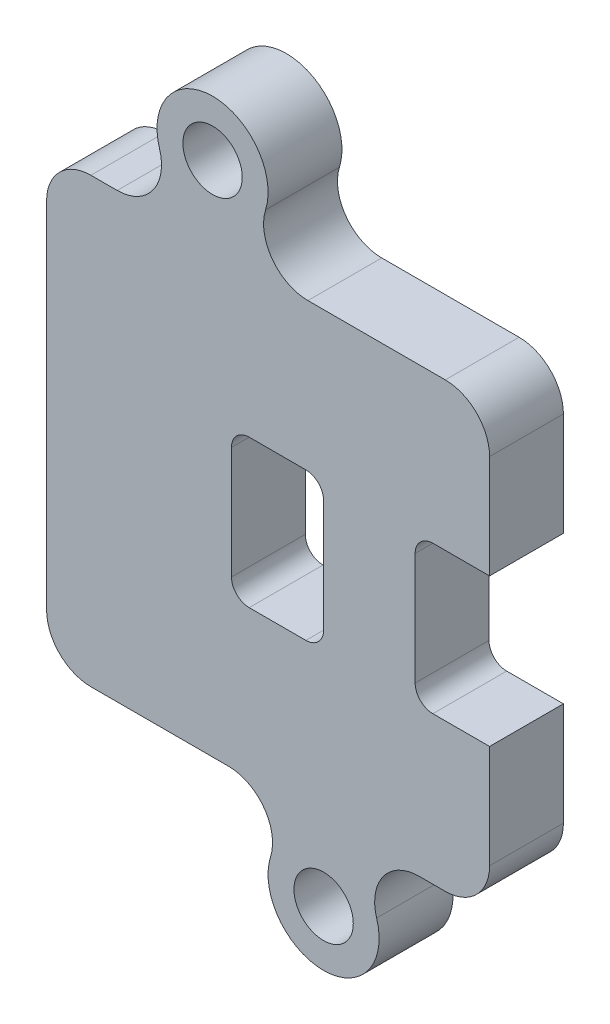
ISO-10303-21;
HEADER;
FILE_DESCRIPTION(('STEP AP214'),'2;1');
FILE_NAME('part.step','',(''),(''),'','','');
FILE_SCHEMA(('AUTOMOTIVE_DESIGN { 1 0 10303 214 1 1 1 1 }'));
ENDSEC;
DATA;
#1=APPLICATION_CONTEXT('core data for automotive mechanical design processes');
#2=APPLICATION_PROTOCOL_DEFINITION('international standard','automotive_design',2000,#1);
#3=PRODUCT_CONTEXT('',#1,'mechanical');
#4=PRODUCT('Part','Part','',(#3));
#5=PRODUCT_RELATED_PRODUCT_CATEGORY('part','',(#4));
#6=PRODUCT_DEFINITION_FORMATION('','',#4);
#7=PRODUCT_DEFINITION_CONTEXT('part definition',#1,'design');
#8=PRODUCT_DEFINITION('design','',#6,#7);
#9=PRODUCT_DEFINITION_SHAPE('','',#8);
#10=(LENGTH_UNIT() NAMED_UNIT(*) SI_UNIT(.MILLI.,.METRE.));
#11=(NAMED_UNIT(*) PLANE_ANGLE_UNIT() SI_UNIT($,.RADIAN.));
#12=(NAMED_UNIT(*) SI_UNIT($,.STERADIAN.) SOLID_ANGLE_UNIT());
#13=UNCERTAINTY_MEASURE_WITH_UNIT(LENGTH_MEASURE(1.E-05),#10,'distance_accuracy_value','');
#14=(GEOMETRIC_REPRESENTATION_CONTEXT(3) GLOBAL_UNCERTAINTY_ASSIGNED_CONTEXT((#13)) GLOBAL_UNIT_ASSIGNED_CONTEXT((#10,
#11,#12)) REPRESENTATION_CONTEXT('',''));
#15=CARTESIAN_POINT('',(0.,0.,0.));
#16=DIRECTION('',(0.,0.,1.));
#17=DIRECTION('',(1.,0.,0.));
#18=AXIS2_PLACEMENT_3D('',#15,#16,#17);
#19=CARTESIAN_POINT('',(-1.524,20.574,6.35));
#20=DIRECTION('',(0.,0.,-1.));
#21=DIRECTION('',(-1.,0.,0.));
#22=AXIS2_PLACEMENT_3D('',#19,#20,#21);
#23=CYLINDRICAL_SURFACE('',#22,1.524);
#24=CARTESIAN_POINT('',(-1.524,20.574,0.));
#25=DIRECTION('',(0.,0.,1.));
#26=DIRECTION('',(1.,0.,0.));
#27=AXIS2_PLACEMENT_3D('',#24,#25,#26);
#28=CIRCLE('',#27,1.524);
#29=CARTESIAN_POINT('',(-1.524,19.05,0.));
#30=VERTEX_POINT('',#29);
#31=CARTESIAN_POINT('',(0.,20.574,0.));
#32=VERTEX_POINT('',#31);
#33=EDGE_CURVE('E357',#30,#32,#28,.T.);
#34=ORIENTED_EDGE('',*,*,#33,.F.);
#35=DIRECTION('',(0.,0.,-1.));
#36=VECTOR('',#35,1.);
#37=CARTESIAN_POINT('',(-1.524,19.05,6.35));
#38=LINE('',#37,#36);
#39=CARTESIAN_POINT('',(-1.524,19.05,6.35));
#40=VERTEX_POINT('',#39);
#41=EDGE_CURVE('E11',#40,#30,#38,.T.);
#42=ORIENTED_EDGE('',*,*,#41,.F.);
#43=CARTESIAN_POINT('',(-1.524,20.574,6.35));
#44=DIRECTION('',(0.,0.,1.));
#45=DIRECTION('',(1.,0.,0.));
#46=AXIS2_PLACEMENT_3D('',#43,#44,#45);
#47=CIRCLE('',#46,1.524);
#48=CARTESIAN_POINT('',(0.,20.574,6.35));
#49=VERTEX_POINT('',#48);
#50=EDGE_CURVE('E431',#40,#49,#47,.T.);
#51=ORIENTED_EDGE('',*,*,#50,.T.);
#52=DIRECTION('',(0.,0.,-1.));
#53=VECTOR('',#52,1.);
#54=CARTESIAN_POINT('',(0.,20.574,6.35));
#55=LINE('',#54,#53);
#56=EDGE_CURVE('E156',#49,#32,#55,.T.);
#57=ORIENTED_EDGE('',*,*,#56,.T.);
#58=EDGE_LOOP('',(#34,#42,#51,#57));
#59=FACE_BOUND('',#58,.T.);
#60=ADVANCED_FACE('F37',(#59),#23,.F.);
#61=CARTESIAN_POINT('',(0.,19.05,6.35));
#62=DIRECTION('',(0.,1.,0.));
#63=DIRECTION('',(-1.,0.,0.));
#64=AXIS2_PLACEMENT_3D('',#61,#62,#63);
#65=PLANE('',#64);
#66=DIRECTION('',(1.,0.,0.));
#67=VECTOR('',#66,1.);
#68=CARTESIAN_POINT('',(0.,19.05,0.));
#69=LINE('',#68,#67);
#70=CARTESIAN_POINT('',(-6.4008,19.05,0.));
#71=VERTEX_POINT('',#70);
#72=EDGE_CURVE('E354',#71,#30,#69,.T.);
#73=ORIENTED_EDGE('',*,*,#72,.F.);
#74=DIRECTION('',(0.,0.,-1.));
#75=VECTOR('',#74,1.);
#76=CARTESIAN_POINT('',(-6.4008,19.05,6.35));
#77=LINE('',#76,#75);
#78=CARTESIAN_POINT('',(-6.4008,19.05,6.35));
#79=VERTEX_POINT('',#78);
#80=EDGE_CURVE('E47',#79,#71,#77,.T.);
#81=ORIENTED_EDGE('',*,*,#80,.F.);
#82=DIRECTION('',(1.,0.,0.));
#83=VECTOR('',#82,1.);
#84=CARTESIAN_POINT('',(0.,19.05,6.35));
#85=LINE('',#84,#83);
#86=EDGE_CURVE('E428',#79,#40,#85,.T.);
#87=ORIENTED_EDGE('',*,*,#86,.T.);
#88=ORIENTED_EDGE('',*,*,#41,.T.);
#89=EDGE_LOOP('',(#73,#81,#87,#88));
#90=FACE_BOUND('',#89,.T.);
#91=ADVANCED_FACE('F590',(#90),#65,.T.);
#92=CARTESIAN_POINT('',(-6.4008,20.574,6.35));
#93=DIRECTION('',(0.,0.,-1.));
#94=DIRECTION('',(-1.,0.,0.));
#95=AXIS2_PLACEMENT_3D('',#92,#93,#94);
#96=CYLINDRICAL_SURFACE('',#95,1.524);
#97=CARTESIAN_POINT('',(-6.4008,20.574,0.));
#98=DIRECTION('',(0.,0.,1.));
#99=DIRECTION('',(1.,0.,0.));
#100=AXIS2_PLACEMENT_3D('',#97,#98,#99);
#101=CIRCLE('',#100,1.524);
#102=CARTESIAN_POINT('',(-7.9248,20.574,0.));
#103=VERTEX_POINT('',#102);
#104=EDGE_CURVE('E351',#103,#71,#101,.T.);
#105=ORIENTED_EDGE('',*,*,#104,.F.);
#106=DIRECTION('',(0.,0.,-1.));
#107=VECTOR('',#106,1.);
#108=CARTESIAN_POINT('',(-7.9248,20.574,6.35));
#109=LINE('',#108,#107);
#110=CARTESIAN_POINT('',(-7.9248,20.574,6.35));
#111=VERTEX_POINT('',#110);
#112=EDGE_CURVE('E275',#111,#103,#109,.T.);
#113=ORIENTED_EDGE('',*,*,#112,.F.);
#114=CARTESIAN_POINT('',(-6.4008,20.574,6.35));
#115=DIRECTION('',(0.,0.,1.));
#116=DIRECTION('',(1.,0.,0.));
#117=AXIS2_PLACEMENT_3D('',#114,#115,#116);
#118=CIRCLE('',#117,1.524);
#119=EDGE_CURVE('E425',#111,#79,#118,.T.);
#120=ORIENTED_EDGE('',*,*,#119,.T.);
#121=ORIENTED_EDGE('',*,*,#80,.T.);
#122=EDGE_LOOP('',(#105,#113,#120,#121));
#123=FACE_BOUND('',#122,.T.);
#124=ADVANCED_FACE('F595',(#123),#96,.F.);
#125=CARTESIAN_POINT('',(-7.92479999999999,0.,6.35));
#126=DIRECTION('',(1.,0.,0.));
#127=DIRECTION('',(0.,1.,0.));
#128=AXIS2_PLACEMENT_3D('',#125,#126,#127);
#129=PLANE('',#128);
#130=DIRECTION('',(0.,-1.,0.));
#131=VECTOR('',#130,1.);
#132=CARTESIAN_POINT('',(-7.92479999999999,0.,0.));
#133=LINE('',#132,#131);
#134=CARTESIAN_POINT('',(-7.9248,30.226,0.));
#135=VERTEX_POINT('',#134);
#136=EDGE_CURVE('E348',#135,#103,#133,.T.);
#137=ORIENTED_EDGE('',*,*,#136,.F.);
#138=DIRECTION('',(0.,0.,-1.));
#139=VECTOR('',#138,1.);
#140=CARTESIAN_POINT('',(-7.9248,30.226,6.35));
#141=LINE('',#140,#139);
#142=CARTESIAN_POINT('',(-7.9248,30.226,6.35));
#143=VERTEX_POINT('',#142);
#144=EDGE_CURVE('E269',#143,#135,#141,.T.);
#145=ORIENTED_EDGE('',*,*,#144,.F.);
#146=DIRECTION('',(0.,-1.,0.));
#147=VECTOR('',#146,1.);
#148=CARTESIAN_POINT('',(-7.92479999999999,0.,6.35));
#149=LINE('',#148,#147);
#150=EDGE_CURVE('E422',#143,#111,#149,.T.);
#151=ORIENTED_EDGE('',*,*,#150,.T.);
#152=ORIENTED_EDGE('',*,*,#112,.T.);
#153=EDGE_LOOP('',(#137,#145,#151,#152));
#154=FACE_BOUND('',#153,.T.);
#155=ADVANCED_FACE('F619',(#154),#129,.T.);
#156=CARTESIAN_POINT('',(-6.4008,30.226,6.35));
#157=DIRECTION('',(0.,0.,-1.));
#158=DIRECTION('',(-1.,0.,0.));
#159=AXIS2_PLACEMENT_3D('',#156,#157,#158);
#160=CYLINDRICAL_SURFACE('',#159,1.524);
#161=CARTESIAN_POINT('',(-6.4008,30.226,0.));
#162=DIRECTION('',(0.,0.,1.));
#163=DIRECTION('',(1.,0.,0.));
#164=AXIS2_PLACEMENT_3D('',#161,#162,#163);
#165=CIRCLE('',#164,1.524);
#166=CARTESIAN_POINT('',(-6.4008,31.75,0.));
#167=VERTEX_POINT('',#166);
#168=EDGE_CURVE('E345',#167,#135,#165,.T.);
#169=ORIENTED_EDGE('',*,*,#168,.F.);
#170=DIRECTION('',(0.,0.,-1.));
#171=VECTOR('',#170,1.);
#172=CARTESIAN_POINT('',(-6.4008,31.75,6.35));
#173=LINE('',#172,#171);
#174=CARTESIAN_POINT('',(-6.4008,31.75,6.35));
#175=VERTEX_POINT('',#174);
#176=EDGE_CURVE('E267',#175,#167,#173,.T.);
#177=ORIENTED_EDGE('',*,*,#176,.F.);
#178=CARTESIAN_POINT('',(-6.4008,30.226,6.35));
#179=DIRECTION('',(0.,0.,1.));
#180=DIRECTION('',(1.,0.,0.));
#181=AXIS2_PLACEMENT_3D('',#178,#179,#180);
#182=CIRCLE('',#181,1.524);
#183=EDGE_CURVE('E261',#175,#143,#182,.T.);
#184=ORIENTED_EDGE('',*,*,#183,.T.);
#185=ORIENTED_EDGE('',*,*,#144,.T.);
#186=EDGE_LOOP('',(#169,#177,#184,#185));
#187=FACE_BOUND('',#186,.T.);
#188=ADVANCED_FACE('F616',(#187),#160,.F.);
#189=CARTESIAN_POINT('',(0.,31.75,6.35));
#190=DIRECTION('',(0.,1.,0.));
#191=DIRECTION('',(0.,0.,1.));
#192=AXIS2_PLACEMENT_3D('',#189,#190,#191);
#193=PLANE('',#192);
#194=DIRECTION('',(1.,0.,0.));
#195=VECTOR('',#194,1.);
#196=CARTESIAN_POINT('',(0.,31.75,0.));
#197=LINE('',#196,#195);
#198=CARTESIAN_POINT('',(-1.524,31.75,0.));
#199=VERTEX_POINT('',#198);
#200=EDGE_CURVE('E266',#167,#199,#197,.T.);
#201=ORIENTED_EDGE('',*,*,#200,.T.);
#202=DIRECTION('',(0.,0.,-1.));
#203=VECTOR('',#202,1.);
#204=CARTESIAN_POINT('',(-1.524,31.75,6.35));
#205=LINE('',#204,#203);
#206=CARTESIAN_POINT('',(-1.524,31.75,6.35));
#207=VERTEX_POINT('',#206);
#208=EDGE_CURVE('E250',#207,#199,#205,.T.);
#209=ORIENTED_EDGE('',*,*,#208,.F.);
#210=DIRECTION('',(1.,0.,0.));
#211=VECTOR('',#210,1.);
#212=CARTESIAN_POINT('',(0.,31.75,6.35));
#213=LINE('',#212,#211);
#214=EDGE_CURVE('E253',#175,#207,#213,.T.);
#215=ORIENTED_EDGE('',*,*,#214,.F.);
#216=ORIENTED_EDGE('',*,*,#176,.T.);
#217=EDGE_LOOP('',(#201,#209,#215,#216));
#218=FACE_BOUND('',#217,.T.);
#219=ADVANCED_FACE('F264',(#218),#193,.F.);
#220=CARTESIAN_POINT('',(-1.524,30.226,6.35));
#221=DIRECTION('',(0.,0.,-1.));
#222=DIRECTION('',(-1.,0.,0.));
#223=AXIS2_PLACEMENT_3D('',#220,#221,#222);
#224=CYLINDRICAL_SURFACE('',#223,1.524);
#225=CARTESIAN_POINT('',(-1.524,30.226,0.));
#226=DIRECTION('',(0.,0.,1.));
#227=DIRECTION('',(1.,0.,0.));
#228=AXIS2_PLACEMENT_3D('',#225,#226,#227);
#229=CIRCLE('',#228,1.524);
#230=CARTESIAN_POINT('',(0.,30.226,0.));
#231=VERTEX_POINT('',#230);
#232=EDGE_CURVE('E342',#199,#231,#229,.F.);
#233=ORIENTED_EDGE('',*,*,#232,.T.);
#234=DIRECTION('',(0.,0.,-1.));
#235=VECTOR('',#234,1.);
#236=CARTESIAN_POINT('',(0.,30.226,6.35));
#237=LINE('',#236,#235);
#238=CARTESIAN_POINT('',(0.,30.226,6.35));
#239=VERTEX_POINT('',#238);
#240=EDGE_CURVE('E252',#239,#231,#237,.T.);
#241=ORIENTED_EDGE('',*,*,#240,.F.);
#242=CARTESIAN_POINT('',(-1.524,30.226,6.35));
#243=DIRECTION('',(0.,0.,1.));
#244=DIRECTION('',(1.,0.,0.));
#245=AXIS2_PLACEMENT_3D('',#242,#243,#244);
#246=CIRCLE('',#245,1.524);
#247=EDGE_CURVE('E245',#207,#239,#246,.F.);
#248=ORIENTED_EDGE('',*,*,#247,.F.);
#249=ORIENTED_EDGE('',*,*,#208,.T.);
#250=EDGE_LOOP('',(#233,#241,#248,#249));
#251=FACE_BOUND('',#250,.T.);
#252=ADVANCED_FACE('F248',(#251),#224,.F.);
#253=CARTESIAN_POINT('',(-8.20085721373077,2.54,6.35));
#254=DIRECTION('',(0.,0.,-1.));
#255=DIRECTION('',(-1.,0.,0.));
#256=AXIS2_PLACEMENT_3D('',#253,#254,#255);
#257=CYLINDRICAL_SURFACE('',#256,3.81);
#258=CARTESIAN_POINT('',(-8.20085721373077,2.54,0.));
#259=DIRECTION('',(0.,0.,1.));
#260=DIRECTION('',(1.,0.,0.));
#261=AXIS2_PLACEMENT_3D('',#258,#259,#260);
#262=CIRCLE('',#261,3.81);
#263=CARTESIAN_POINT('',(-4.56142353899818,1.41278106508876,0.));
#264=VERTEX_POINT('',#263);
#265=CARTESIAN_POINT('',(-8.20085721373077,6.35,0.));
#266=VERTEX_POINT('',#265);
#267=EDGE_CURVE('E412',#264,#266,#262,.T.);
#268=ORIENTED_EDGE('',*,*,#267,.F.);
#269=DIRECTION('',(0.,0.,-1.));
#270=VECTOR('',#269,1.);
#271=CARTESIAN_POINT('',(-4.56142353899818,1.41278106508876,6.35));
#272=LINE('',#271,#270);
#273=CARTESIAN_POINT('',(-4.56142353899818,1.41278106508876,6.35));
#274=VERTEX_POINT('',#273);
#275=EDGE_CURVE('E41',#274,#264,#272,.T.);
#276=ORIENTED_EDGE('',*,*,#275,.F.);
#277=CARTESIAN_POINT('',(-8.20085721373077,2.54,6.35));
#278=DIRECTION('',(0.,0.,1.));
#279=DIRECTION('',(1.,0.,0.));
#280=AXIS2_PLACEMENT_3D('',#277,#278,#279);
#281=CIRCLE('',#280,3.81);
#282=CARTESIAN_POINT('',(-8.20085721373077,6.35,6.35));
#283=VERTEX_POINT('',#282);
#284=EDGE_CURVE('E337',#274,#283,#281,.T.);
#285=ORIENTED_EDGE('',*,*,#284,.T.);
#286=DIRECTION('',(0.,0.,-1.));
#287=VECTOR('',#286,1.);
#288=CARTESIAN_POINT('',(-8.20085721373077,6.35,6.35));
#289=LINE('',#288,#287);
#290=EDGE_CURVE('E278',#283,#266,#289,.T.);
#291=ORIENTED_EDGE('',*,*,#290,.T.);
#292=EDGE_LOOP('',(#268,#276,#285,#291));
#293=FACE_BOUND('',#292,.T.);
#294=ADVANCED_FACE('F39',(#293),#257,.F.);
#295=CARTESIAN_POINT('',(0.,0.,6.35));
#296=DIRECTION('',(0.,0.,-1.));
#297=DIRECTION('',(-1.,0.,0.));
#298=AXIS2_PLACEMENT_3D('',#295,#296,#297);
#299=CYLINDRICAL_SURFACE('',#298,4.7752);
#300=CARTESIAN_POINT('',(0.,0.,0.));
#301=DIRECTION('',(0.,0.,1.));
#302=DIRECTION('',(1.,0.,0.));
#303=AXIS2_PLACEMENT_3D('',#300,#301,#302);
#304=CIRCLE('',#303,4.7752);
#305=CARTESIAN_POINT('',(4.56142353899818,1.41278106508876,0.));
#306=VERTEX_POINT('',#305);
#307=EDGE_CURVE('E410',#264,#306,#304,.T.);
#308=ORIENTED_EDGE('',*,*,#307,.T.);
#309=DIRECTION('',(0.,0.,-1.));
#310=VECTOR('',#309,1.);
#311=CARTESIAN_POINT('',(4.56142353899818,1.41278106508876,6.35));
#312=LINE('',#311,#310);
#313=CARTESIAN_POINT('',(4.56142353899818,1.41278106508876,6.35));
#314=VERTEX_POINT('',#313);
#315=EDGE_CURVE('E325',#314,#306,#312,.T.);
#316=ORIENTED_EDGE('',*,*,#315,.F.);
#317=CARTESIAN_POINT('',(0.,0.,6.35));
#318=DIRECTION('',(0.,0.,1.));
#319=DIRECTION('',(1.,0.,0.));
#320=AXIS2_PLACEMENT_3D('',#317,#318,#319);
#321=CIRCLE('',#320,4.7752);
#322=EDGE_CURVE('E480',#274,#314,#321,.T.);
#323=ORIENTED_EDGE('',*,*,#322,.F.);
#324=ORIENTED_EDGE('',*,*,#275,.T.);
#325=EDGE_LOOP('',(#308,#316,#323,#324));
#326=FACE_BOUND('',#325,.T.);
#327=ADVANCED_FACE('F495',(#326),#299,.T.);
#328=CARTESIAN_POINT('',(8.20085721373077,2.54,6.35));
#329=DIRECTION('',(0.,0.,-1.));
#330=DIRECTION('',(-1.,0.,0.));
#331=AXIS2_PLACEMENT_3D('',#328,#329,#330);
#332=CYLINDRICAL_SURFACE('',#331,3.81);
#333=CARTESIAN_POINT('',(8.20085721373077,2.54,0.));
#334=DIRECTION('',(0.,0.,1.));
#335=DIRECTION('',(1.,0.,0.));
#336=AXIS2_PLACEMENT_3D('',#333,#334,#335);
#337=CIRCLE('',#336,3.81);
#338=CARTESIAN_POINT('',(8.20085721373077,6.35,0.));
#339=VERTEX_POINT('',#338);
#340=EDGE_CURVE('E408',#306,#339,#337,.F.);
#341=ORIENTED_EDGE('',*,*,#340,.T.);
#342=DIRECTION('',(0.,0.,-1.));
#343=VECTOR('',#342,1.);
#344=CARTESIAN_POINT('',(8.20085721373077,6.35,6.35));
#345=LINE('',#344,#343);
#346=CARTESIAN_POINT('',(8.20085721373077,6.35,6.35));
#347=VERTEX_POINT('',#346);
#348=EDGE_CURVE('E323',#347,#339,#345,.T.);
#349=ORIENTED_EDGE('',*,*,#348,.F.);
#350=CARTESIAN_POINT('',(8.20085721373077,2.54,6.35));
#351=DIRECTION('',(0.,0.,1.));
#352=DIRECTION('',(1.,0.,0.));
#353=AXIS2_PLACEMENT_3D('',#350,#351,#352);
#354=CIRCLE('',#353,3.81);
#355=EDGE_CURVE('E478',#314,#347,#354,.F.);
#356=ORIENTED_EDGE('',*,*,#355,.F.);
#357=ORIENTED_EDGE('',*,*,#315,.T.);
#358=EDGE_LOOP('',(#341,#349,#356,#357));
#359=FACE_BOUND('',#358,.T.);
#360=ADVANCED_FACE('F497',(#359),#332,.F.);
#361=CARTESIAN_POINT('',(0.,6.35,6.35));
#362=DIRECTION('',(0.,1.,0.));
#363=DIRECTION('',(-1.,0.,0.));
#364=AXIS2_PLACEMENT_3D('',#361,#362,#363);
#365=PLANE('',#364);
#366=DIRECTION('',(1.,0.,0.));
#367=VECTOR('',#366,1.);
#368=CARTESIAN_POINT('',(0.,6.35,0.));
#369=LINE('',#368,#367);
#370=CARTESIAN_POINT('',(10.4648,6.35,0.));
#371=VERTEX_POINT('',#370);
#372=EDGE_CURVE('E406',#339,#371,#369,.T.);
#373=ORIENTED_EDGE('',*,*,#372,.T.);
#374=DIRECTION('',(0.,0.,-1.));
#375=VECTOR('',#374,1.);
#376=CARTESIAN_POINT('',(10.4648,6.35,6.35));
#377=LINE('',#376,#375);
#378=CARTESIAN_POINT('',(10.4648,6.35,6.35));
#379=VERTEX_POINT('',#378);
#380=EDGE_CURVE('E320',#379,#371,#377,.T.);
#381=ORIENTED_EDGE('',*,*,#380,.F.);
#382=DIRECTION('',(1.,0.,0.));
#383=VECTOR('',#382,1.);
#384=CARTESIAN_POINT('',(0.,6.35,6.35));
#385=LINE('',#384,#383);
#386=EDGE_CURVE('E476',#347,#379,#385,.T.);
#387=ORIENTED_EDGE('',*,*,#386,.F.);
#388=ORIENTED_EDGE('',*,*,#348,.T.);
#389=EDGE_LOOP('',(#373,#381,#387,#388));
#390=FACE_BOUND('',#389,.T.);
#391=ADVANCED_FACE('F504',(#390),#365,.F.);
#392=CARTESIAN_POINT('',(10.4648,10.16,6.35));
#393=DIRECTION('',(0.,0.,-1.));
#394=DIRECTION('',(-1.,0.,0.));
#395=AXIS2_PLACEMENT_3D('',#392,#393,#394);
#396=CYLINDRICAL_SURFACE('',#395,3.81);
#397=CARTESIAN_POINT('',(10.4648,10.16,0.));
#398=DIRECTION('',(0.,0.,1.));
#399=DIRECTION('',(1.,0.,0.));
#400=AXIS2_PLACEMENT_3D('',#397,#398,#399);
#401=CIRCLE('',#400,3.81);
#402=CARTESIAN_POINT('',(14.2748,10.16,0.));
#403=VERTEX_POINT('',#402);
#404=EDGE_CURVE('E403',#371,#403,#401,.T.);
#405=ORIENTED_EDGE('',*,*,#404,.T.);
#406=DIRECTION('',(0.,0.,-1.));
#407=VECTOR('',#406,1.);
#408=CARTESIAN_POINT('',(14.2748,10.16,6.35));
#409=LINE('',#408,#407);
#410=CARTESIAN_POINT('',(14.2748,10.16,6.35));
#411=VERTEX_POINT('',#410);
#412=EDGE_CURVE('E318',#411,#403,#409,.T.);
#413=ORIENTED_EDGE('',*,*,#412,.F.);
#414=CARTESIAN_POINT('',(10.4648,10.16,6.35));
#415=DIRECTION('',(0.,0.,1.));
#416=DIRECTION('',(1.,0.,0.));
#417=AXIS2_PLACEMENT_3D('',#414,#415,#416);
#418=CIRCLE('',#417,3.81);
#419=EDGE_CURVE('E474',#379,#411,#418,.T.);
#420=ORIENTED_EDGE('',*,*,#419,.F.);
#421=ORIENTED_EDGE('',*,*,#380,.T.);
#422=EDGE_LOOP('',(#405,#413,#420,#421));
#423=FACE_BOUND('',#422,.T.);
#424=ADVANCED_FACE('F507',(#423),#396,.T.);
#425=CARTESIAN_POINT('',(14.2748,0.,6.35));
#426=DIRECTION('',(1.,0.,0.));
#427=DIRECTION('',(0.,0.,-1.));
#428=AXIS2_PLACEMENT_3D('',#425,#426,#427);
#429=PLANE('',#428);
#430=DIRECTION('',(0.,-1.,0.));
#431=VECTOR('',#430,1.);
#432=CARTESIAN_POINT('',(14.2748,0.,0.));
#433=LINE('',#432,#431);
#434=CARTESIAN_POINT('',(14.2748,19.05,0.));
#435=VERTEX_POINT('',#434);
#436=EDGE_CURVE('E400',#435,#403,#433,.T.);
#437=ORIENTED_EDGE('',*,*,#436,.F.);
#438=DIRECTION('',(0.,0.,-1.));
#439=VECTOR('',#438,1.);
#440=CARTESIAN_POINT('',(14.2748,19.05,6.35));
#441=LINE('',#440,#439);
#442=CARTESIAN_POINT('',(14.2748,19.05,6.35));
#443=VERTEX_POINT('',#442);
#444=EDGE_CURVE('E316',#443,#435,#441,.T.);
#445=ORIENTED_EDGE('',*,*,#444,.F.);
#446=DIRECTION('',(0.,-1.,0.));
#447=VECTOR('',#446,1.);
#448=CARTESIAN_POINT('',(14.2748,0.,6.35));
#449=LINE('',#448,#447);
#450=EDGE_CURVE('E471',#443,#411,#449,.T.);
#451=ORIENTED_EDGE('',*,*,#450,.T.);
#452=ORIENTED_EDGE('',*,*,#412,.T.);
#453=EDGE_LOOP('',(#437,#445,#451,#452));
#454=FACE_BOUND('',#453,.T.);
#455=ADVANCED_FACE('F510',(#454),#429,.T.);
#456=CARTESIAN_POINT('',(0.,19.05,6.35));
#457=DIRECTION('',(0.,1.,0.));
#458=DIRECTION('',(-1.,0.,0.));
#459=AXIS2_PLACEMENT_3D('',#456,#457,#458);
#460=PLANE('',#459);
#461=DIRECTION('',(1.,0.,0.));
#462=VECTOR('',#461,1.);
#463=CARTESIAN_POINT('',(0.,19.05,0.));
#464=LINE('',#463,#462);
#465=CARTESIAN_POINT('',(9.398,19.05,0.));
#466=VERTEX_POINT('',#465);
#467=EDGE_CURVE('E397',#466,#435,#464,.T.);
#468=ORIENTED_EDGE('',*,*,#467,.F.);
#469=DIRECTION('',(0.,0.,-1.));
#470=VECTOR('',#469,1.);
#471=CARTESIAN_POINT('',(9.398,19.05,6.35));
#472=LINE('',#471,#470);
#473=CARTESIAN_POINT('',(9.398,19.05,6.35));
#474=VERTEX_POINT('',#473);
#475=EDGE_CURVE('E314',#474,#466,#472,.T.);
#476=ORIENTED_EDGE('',*,*,#475,.F.);
#477=DIRECTION('',(1.,0.,0.));
#478=VECTOR('',#477,1.);
#479=CARTESIAN_POINT('',(0.,19.05,6.35));
#480=LINE('',#479,#478);
#481=EDGE_CURVE('E468',#474,#443,#480,.T.);
#482=ORIENTED_EDGE('',*,*,#481,.T.);
#483=ORIENTED_EDGE('',*,*,#444,.T.);
#484=EDGE_LOOP('',(#468,#476,#482,#483));
#485=FACE_BOUND('',#484,.T.);
#486=ADVANCED_FACE('F515',(#485),#460,.T.);
#487=CARTESIAN_POINT('',(9.398,20.574,6.35));
#488=DIRECTION('',(0.,0.,-1.));
#489=DIRECTION('',(-1.,0.,0.));
#490=AXIS2_PLACEMENT_3D('',#487,#488,#489);
#491=CYLINDRICAL_SURFACE('',#490,1.524);
#492=CARTESIAN_POINT('',(9.398,20.574,0.));
#493=DIRECTION('',(0.,0.,1.));
#494=DIRECTION('',(1.,0.,0.));
#495=AXIS2_PLACEMENT_3D('',#492,#493,#494);
#496=CIRCLE('',#495,1.524);
#497=CARTESIAN_POINT('',(7.874,20.574,0.));
#498=VERTEX_POINT('',#497);
#499=EDGE_CURVE('E394',#498,#466,#496,.T.);
#500=ORIENTED_EDGE('',*,*,#499,.F.);
#501=DIRECTION('',(0.,0.,-1.));
#502=VECTOR('',#501,1.);
#503=CARTESIAN_POINT('',(7.874,20.574,6.35));
#504=LINE('',#503,#502);
#505=CARTESIAN_POINT('',(7.874,20.574,6.35));
#506=VERTEX_POINT('',#505);
#507=EDGE_CURVE('E312',#506,#498,#504,.T.);
#508=ORIENTED_EDGE('',*,*,#507,.F.);
#509=CARTESIAN_POINT('',(9.398,20.574,6.35));
#510=DIRECTION('',(0.,0.,1.));
#511=DIRECTION('',(1.,0.,0.));
#512=AXIS2_PLACEMENT_3D('',#509,#510,#511);
#513=CIRCLE('',#512,1.524);
#514=EDGE_CURVE('E465',#506,#474,#513,.T.);
#515=ORIENTED_EDGE('',*,*,#514,.T.);
#516=ORIENTED_EDGE('',*,*,#475,.T.);
#517=EDGE_LOOP('',(#500,#508,#515,#516));
#518=FACE_BOUND('',#517,.T.);
#519=ADVANCED_FACE('F518',(#518),#491,.F.);
#520=CARTESIAN_POINT('',(7.874,0.,6.35));
#521=DIRECTION('',(1.,0.,0.));
#522=DIRECTION('',(0.,1.,0.));
#523=AXIS2_PLACEMENT_3D('',#520,#521,#522);
#524=PLANE('',#523);
#525=DIRECTION('',(0.,-1.,0.));
#526=VECTOR('',#525,1.);
#527=CARTESIAN_POINT('',(7.874,0.,0.));
#528=LINE('',#527,#526);
#529=CARTESIAN_POINT('',(7.874,30.226,0.));
#530=VERTEX_POINT('',#529);
#531=EDGE_CURVE('E391',#530,#498,#528,.T.);
#532=ORIENTED_EDGE('',*,*,#531,.F.);
#533=DIRECTION('',(0.,0.,-1.));
#534=VECTOR('',#533,1.);
#535=CARTESIAN_POINT('',(7.874,30.226,6.35));
#536=LINE('',#535,#534);
#537=CARTESIAN_POINT('',(7.874,30.226,6.35));
#538=VERTEX_POINT('',#537);
#539=EDGE_CURVE('E310',#538,#530,#536,.T.);
#540=ORIENTED_EDGE('',*,*,#539,.F.);
#541=DIRECTION('',(0.,-1.,0.));
#542=VECTOR('',#541,1.);
#543=CARTESIAN_POINT('',(7.874,0.,6.35));
#544=LINE('',#543,#542);
#545=EDGE_CURVE('E462',#538,#506,#544,.T.);
#546=ORIENTED_EDGE('',*,*,#545,.T.);
#547=ORIENTED_EDGE('',*,*,#507,.T.);
#548=EDGE_LOOP('',(#532,#540,#546,#547));
#549=FACE_BOUND('',#548,.T.);
#550=ADVANCED_FACE('F523',(#549),#524,.T.);
#551=CARTESIAN_POINT('',(9.398,30.226,6.35));
#552=DIRECTION('',(0.,0.,-1.));
#553=DIRECTION('',(-1.,0.,0.));
#554=AXIS2_PLACEMENT_3D('',#551,#552,#553);
#555=CYLINDRICAL_SURFACE('',#554,1.524);
#556=CARTESIAN_POINT('',(9.398,30.226,0.));
#557=DIRECTION('',(0.,0.,1.));
#558=DIRECTION('',(1.,0.,0.));
#559=AXIS2_PLACEMENT_3D('',#556,#557,#558);
#560=CIRCLE('',#559,1.524);
#561=CARTESIAN_POINT('',(9.398,31.75,0.));
#562=VERTEX_POINT('',#561);
#563=EDGE_CURVE('E388',#562,#530,#560,.T.);
#564=ORIENTED_EDGE('',*,*,#563,.F.);
#565=DIRECTION('',(0.,0.,-1.));
#566=VECTOR('',#565,1.);
#567=CARTESIAN_POINT('',(9.398,31.75,6.35));
#568=LINE('',#567,#566);
#569=CARTESIAN_POINT('',(9.398,31.75,6.35));
#570=VERTEX_POINT('',#569);
#571=EDGE_CURVE('E308',#570,#562,#568,.T.);
#572=ORIENTED_EDGE('',*,*,#571,.F.);
#573=CARTESIAN_POINT('',(9.398,30.226,6.35));
#574=DIRECTION('',(0.,0.,1.));
#575=DIRECTION('',(1.,0.,0.));
#576=AXIS2_PLACEMENT_3D('',#573,#574,#575);
#577=CIRCLE('',#576,1.524);
#578=EDGE_CURVE('E459',#570,#538,#577,.T.);
#579=ORIENTED_EDGE('',*,*,#578,.T.);
#580=ORIENTED_EDGE('',*,*,#539,.T.);
#581=EDGE_LOOP('',(#564,#572,#579,#580));
#582=FACE_BOUND('',#581,.T.);
#583=ADVANCED_FACE('F526',(#582),#555,.F.);
#584=CARTESIAN_POINT('',(0.,31.75,6.35));
#585=DIRECTION('',(0.,1.,0.));
#586=DIRECTION('',(0.,0.,1.));
#587=AXIS2_PLACEMENT_3D('',#584,#585,#586);
#588=PLANE('',#587);
#589=DIRECTION('',(1.,0.,0.));
#590=VECTOR('',#589,1.);
#591=CARTESIAN_POINT('',(0.,31.75,0.));
#592=LINE('',#591,#590);
#593=CARTESIAN_POINT('',(14.2748,31.75,0.));
#594=VERTEX_POINT('',#593);
#595=EDGE_CURVE('E385',#562,#594,#592,.T.);
#596=ORIENTED_EDGE('',*,*,#595,.T.);
#597=DIRECTION('',(0.,0.,-1.));
#598=VECTOR('',#597,1.);
#599=CARTESIAN_POINT('',(14.2748,31.75,6.35));
#600=LINE('',#599,#598);
#601=CARTESIAN_POINT('',(14.2748,31.75,6.35));
#602=VERTEX_POINT('',#601);
#603=EDGE_CURVE('E306',#602,#594,#600,.T.);
#604=ORIENTED_EDGE('',*,*,#603,.F.);
#605=DIRECTION('',(1.,0.,0.));
#606=VECTOR('',#605,1.);
#607=CARTESIAN_POINT('',(0.,31.75,6.35));
#608=LINE('',#607,#606);
#609=EDGE_CURVE('E457',#570,#602,#608,.T.);
#610=ORIENTED_EDGE('',*,*,#609,.F.);
#611=ORIENTED_EDGE('',*,*,#571,.T.);
#612=EDGE_LOOP('',(#596,#604,#610,#611));
#613=FACE_BOUND('',#612,.T.);
#614=ADVANCED_FACE('F533',(#613),#588,.F.);
#615=CARTESIAN_POINT('',(14.2748,40.64,0.));
#616=VERTEX_POINT('',#615);
#617=EDGE_CURVE('E384',#616,#594,#433,.T.);
#618=ORIENTED_EDGE('',*,*,#617,.F.);
#619=DIRECTION('',(0.,0.,-1.));
#620=VECTOR('',#619,1.);
#621=CARTESIAN_POINT('',(14.2748,40.64,6.35));
#622=LINE('',#621,#620);
#623=CARTESIAN_POINT('',(14.2748,40.64,6.35));
#624=VERTEX_POINT('',#623);
#625=EDGE_CURVE('E304',#624,#616,#622,.T.);
#626=ORIENTED_EDGE('',*,*,#625,.F.);
#627=EDGE_CURVE('E456',#624,#602,#449,.T.);
#628=ORIENTED_EDGE('',*,*,#627,.T.);
#629=ORIENTED_EDGE('',*,*,#603,.T.);
#630=EDGE_LOOP('',(#618,#626,#628,#629));
#631=FACE_BOUND('',#630,.T.);
#632=ADVANCED_FACE('F538',(#631),#429,.T.);
#633=CARTESIAN_POINT('',(10.4648,40.64,6.35));
#634=DIRECTION('',(0.,0.,-1.));
#635=DIRECTION('',(-1.,0.,0.));
#636=AXIS2_PLACEMENT_3D('',#633,#634,#635);
#637=CYLINDRICAL_SURFACE('',#636,3.81);
#638=CARTESIAN_POINT('',(10.4648,40.64,0.));
#639=DIRECTION('',(0.,0.,1.));
#640=DIRECTION('',(1.,0.,0.));
#641=AXIS2_PLACEMENT_3D('',#638,#639,#640);
#642=CIRCLE('',#641,3.81);
#643=CARTESIAN_POINT('',(10.4648,44.45,0.));
#644=VERTEX_POINT('',#643);
#645=EDGE_CURVE('E381',#644,#616,#642,.F.);
#646=ORIENTED_EDGE('',*,*,#645,.F.);
#647=DIRECTION('',(0.,0.,-1.));
#648=VECTOR('',#647,1.);
#649=CARTESIAN_POINT('',(10.4648,44.45,6.35));
#650=LINE('',#649,#648);
#651=CARTESIAN_POINT('',(10.4648,44.45,6.35));
#652=VERTEX_POINT('',#651);
#653=EDGE_CURVE('E302',#652,#644,#650,.T.);
#654=ORIENTED_EDGE('',*,*,#653,.F.);
#655=CARTESIAN_POINT('',(10.4648,40.64,6.35));
#656=DIRECTION('',(0.,0.,1.));
#657=DIRECTION('',(1.,0.,0.));
#658=AXIS2_PLACEMENT_3D('',#655,#656,#657);
#659=CIRCLE('',#658,3.81);
#660=EDGE_CURVE('E453',#652,#624,#659,.F.);
#661=ORIENTED_EDGE('',*,*,#660,.T.);
#662=ORIENTED_EDGE('',*,*,#625,.T.);
#663=EDGE_LOOP('',(#646,#654,#661,#662));
#664=FACE_BOUND('',#663,.T.);
#665=ADVANCED_FACE('F541',(#664),#637,.T.);
#666=CARTESIAN_POINT('',(0.,44.45,6.35));
#667=DIRECTION('',(0.,1.,0.));
#668=DIRECTION('',(-1.,0.,0.));
#669=AXIS2_PLACEMENT_3D('',#666,#667,#668);
#670=PLANE('',#669);
#671=DIRECTION('',(1.,0.,0.));
#672=VECTOR('',#671,1.);
#673=CARTESIAN_POINT('',(0.,44.45,0.));
#674=LINE('',#673,#672);
#675=CARTESIAN_POINT('',(-1.34954278626924,44.45,0.));
#676=VERTEX_POINT('',#675);
#677=EDGE_CURVE('E378',#676,#644,#674,.T.);
#678=ORIENTED_EDGE('',*,*,#677,.F.);
#679=DIRECTION('',(0.,0.,-1.));
#680=VECTOR('',#679,1.);
#681=CARTESIAN_POINT('',(-1.34954278626924,44.45,6.35));
#682=LINE('',#681,#680);
#683=CARTESIAN_POINT('',(-1.34954278626924,44.45,6.35));
#684=VERTEX_POINT('',#683);
#685=EDGE_CURVE('E300',#684,#676,#682,.T.);
#686=ORIENTED_EDGE('',*,*,#685,.F.);
#687=DIRECTION('',(1.,0.,0.));
#688=VECTOR('',#687,1.);
#689=CARTESIAN_POINT('',(0.,44.45,6.35));
#690=LINE('',#689,#688);
#691=EDGE_CURVE('E450',#684,#652,#690,.T.);
#692=ORIENTED_EDGE('',*,*,#691,.T.);
#693=ORIENTED_EDGE('',*,*,#653,.T.);
#694=EDGE_LOOP('',(#678,#686,#692,#693));
#695=FACE_BOUND('',#694,.T.);
#696=ADVANCED_FACE('F545',(#695),#670,.T.);
#697=CARTESIAN_POINT('',(-1.34954278626924,48.26,6.35));
#698=DIRECTION('',(0.,0.,-1.));
#699=DIRECTION('',(-1.,0.,0.));
#700=AXIS2_PLACEMENT_3D('',#697,#698,#699);
#701=CYLINDRICAL_SURFACE('',#700,3.80999999999999);
#702=CARTESIAN_POINT('',(-1.34954278626924,48.26,0.));
#703=DIRECTION('',(0.,0.,1.));
#704=DIRECTION('',(1.,0.,0.));
#705=AXIS2_PLACEMENT_3D('',#702,#703,#704);
#706=CIRCLE('',#705,3.80999999999999);
#707=CARTESIAN_POINT('',(-4.98897646100182,49.3872189349112,0.));
#708=VERTEX_POINT('',#707);
#709=EDGE_CURVE('E376',#676,#708,#706,.F.);
#710=ORIENTED_EDGE('',*,*,#709,.T.);
#711=DIRECTION('',(0.,0.,-1.));
#712=VECTOR('',#711,1.);
#713=CARTESIAN_POINT('',(-4.98897646100182,49.3872189349112,6.35));
#714=LINE('',#713,#712);
#715=CARTESIAN_POINT('',(-4.98897646100182,49.3872189349112,6.35));
#716=VERTEX_POINT('',#715);
#717=EDGE_CURVE('E297',#716,#708,#714,.T.);
#718=ORIENTED_EDGE('',*,*,#717,.F.);
#719=CARTESIAN_POINT('',(-1.34954278626924,48.26,6.35));
#720=DIRECTION('',(0.,0.,1.));
#721=DIRECTION('',(1.,0.,0.));
#722=AXIS2_PLACEMENT_3D('',#719,#720,#721);
#723=CIRCLE('',#722,3.80999999999999);
#724=EDGE_CURVE('E448',#684,#716,#723,.F.);
#725=ORIENTED_EDGE('',*,*,#724,.F.);
#726=ORIENTED_EDGE('',*,*,#685,.T.);
#727=EDGE_LOOP('',(#710,#718,#725,#726));
#728=FACE_BOUND('',#727,.T.);
#729=ADVANCED_FACE('F550',(#728),#701,.F.);
#730=CARTESIAN_POINT('',(-9.5504,50.8,6.35));
#731=DIRECTION('',(0.,0.,-1.));
#732=DIRECTION('',(-1.,0.,0.));
#733=AXIS2_PLACEMENT_3D('',#730,#731,#732);
#734=CYLINDRICAL_SURFACE('',#733,4.7752);
#735=CARTESIAN_POINT('',(-9.5504,50.8,0.));
#736=DIRECTION('',(0.,0.,1.));
#737=DIRECTION('',(1.,0.,0.));
#738=AXIS2_PLACEMENT_3D('',#735,#736,#737);
#739=CIRCLE('',#738,4.7752);
#740=CARTESIAN_POINT('',(-14.1118235389982,49.3872189349112,0.));
#741=VERTEX_POINT('',#740);
#742=EDGE_CURVE('E374',#708,#741,#739,.T.);
#743=ORIENTED_EDGE('',*,*,#742,.T.);
#744=DIRECTION('',(0.,0.,-1.));
#745=VECTOR('',#744,1.);
#746=CARTESIAN_POINT('',(-14.1118235389982,49.3872189349112,6.35));
#747=LINE('',#746,#745);
#748=CARTESIAN_POINT('',(-14.1118235389982,49.3872189349112,6.35));
#749=VERTEX_POINT('',#748);
#750=EDGE_CURVE('E294',#749,#741,#747,.T.);
#751=ORIENTED_EDGE('',*,*,#750,.F.);
#752=CARTESIAN_POINT('',(-9.5504,50.8,6.35));
#753=DIRECTION('',(0.,0.,1.));
#754=DIRECTION('',(1.,0.,0.));
#755=AXIS2_PLACEMENT_3D('',#752,#753,#754);
#756=CIRCLE('',#755,4.7752);
#757=EDGE_CURVE('E446',#716,#749,#756,.T.);
#758=ORIENTED_EDGE('',*,*,#757,.F.);
#759=ORIENTED_EDGE('',*,*,#717,.T.);
#760=EDGE_LOOP('',(#743,#751,#758,#759));
#761=FACE_BOUND('',#760,.T.);
#762=ADVANCED_FACE('F557',(#761),#734,.T.);
#763=CARTESIAN_POINT('',(-17.7512572137308,48.26,6.35));
#764=DIRECTION('',(0.,0.,-1.));
#765=DIRECTION('',(-1.,0.,0.));
#766=AXIS2_PLACEMENT_3D('',#763,#764,#765);
#767=CYLINDRICAL_SURFACE('',#766,3.81);
#768=CARTESIAN_POINT('',(-17.7512572137308,48.26,0.));
#769=DIRECTION('',(0.,0.,1.));
#770=DIRECTION('',(1.,0.,0.));
#771=AXIS2_PLACEMENT_3D('',#768,#769,#770);
#772=CIRCLE('',#771,3.81);
#773=CARTESIAN_POINT('',(-17.7512572137308,44.45,0.));
#774=VERTEX_POINT('',#773);
#775=EDGE_CURVE('E371',#741,#774,#772,.F.);
#776=ORIENTED_EDGE('',*,*,#775,.T.);
#777=DIRECTION('',(0.,0.,-1.));
#778=VECTOR('',#777,1.);
#779=CARTESIAN_POINT('',(-17.7512572137308,44.45,6.35));
#780=LINE('',#779,#778);
#781=CARTESIAN_POINT('',(-17.7512572137308,44.45,6.35));
#782=VERTEX_POINT('',#781);
#783=EDGE_CURVE('E292',#782,#774,#780,.T.);
#784=ORIENTED_EDGE('',*,*,#783,.F.);
#785=CARTESIAN_POINT('',(-17.7512572137308,48.26,6.35));
#786=DIRECTION('',(0.,0.,1.));
#787=DIRECTION('',(1.,0.,0.));
#788=AXIS2_PLACEMENT_3D('',#785,#786,#787);
#789=CIRCLE('',#788,3.81);
#790=EDGE_CURVE('E444',#749,#782,#789,.F.);
#791=ORIENTED_EDGE('',*,*,#790,.F.);
#792=ORIENTED_EDGE('',*,*,#750,.T.);
#793=EDGE_LOOP('',(#776,#784,#791,#792));
#794=FACE_BOUND('',#793,.T.);
#795=ADVANCED_FACE('F561',(#794),#767,.F.);
#796=CARTESIAN_POINT('',(-2.72474936998693E-13,44.4500000000001,6.35));
#797=DIRECTION('',(0.,1.,0.));
#798=DIRECTION('',(-1.,0.,0.));
#799=AXIS2_PLACEMENT_3D('',#796,#797,#798);
#800=PLANE('',#799);
#801=DIRECTION('',(1.,0.,0.));
#802=VECTOR('',#801,1.);
#803=CARTESIAN_POINT('',(-2.72474936998693E-13,44.4500000000001,0.));
#804=LINE('',#803,#802);
#805=CARTESIAN_POINT('',(-20.0152,44.45,0.));
#806=VERTEX_POINT('',#805);
#807=EDGE_CURVE('E368',#806,#774,#804,.T.);
#808=ORIENTED_EDGE('',*,*,#807,.F.);
#809=DIRECTION('',(0.,0.,-1.));
#810=VECTOR('',#809,1.);
#811=CARTESIAN_POINT('',(-20.0152,44.45,6.35));
#812=LINE('',#811,#810);
#813=CARTESIAN_POINT('',(-20.0152,44.45,6.35));
#814=VERTEX_POINT('',#813);
#815=EDGE_CURVE('E290',#814,#806,#812,.T.);
#816=ORIENTED_EDGE('',*,*,#815,.F.);
#817=DIRECTION('',(1.,0.,0.));
#818=VECTOR('',#817,1.);
#819=CARTESIAN_POINT('',(-2.72474936998693E-13,44.4500000000001,6.35));
#820=LINE('',#819,#818);
#821=EDGE_CURVE('E441',#814,#782,#820,.T.);
#822=ORIENTED_EDGE('',*,*,#821,.T.);
#823=ORIENTED_EDGE('',*,*,#783,.T.);
#824=EDGE_LOOP('',(#808,#816,#822,#823));
#825=FACE_BOUND('',#824,.T.);
#826=ADVANCED_FACE('F564',(#825),#800,.T.);
#827=CARTESIAN_POINT('',(-20.0152,40.64,6.35));
#828=DIRECTION('',(0.,0.,-1.));
#829=DIRECTION('',(-1.,0.,0.));
#830=AXIS2_PLACEMENT_3D('',#827,#828,#829);
#831=CYLINDRICAL_SURFACE('',#830,3.81);
#832=CARTESIAN_POINT('',(-20.0152,40.64,0.));
#833=DIRECTION('',(0.,0.,1.));
#834=DIRECTION('',(1.,0.,0.));
#835=AXIS2_PLACEMENT_3D('',#832,#833,#834);
#836=CIRCLE('',#835,3.81);
#837=CARTESIAN_POINT('',(-23.8252,40.64,0.));
#838=VERTEX_POINT('',#837);
#839=EDGE_CURVE('E366',#806,#838,#836,.T.);
#840=ORIENTED_EDGE('',*,*,#839,.T.);
#841=DIRECTION('',(0.,0.,-1.));
#842=VECTOR('',#841,1.);
#843=CARTESIAN_POINT('',(-23.8252,40.64,6.35));
#844=LINE('',#843,#842);
#845=CARTESIAN_POINT('',(-23.8252,40.64,6.35));
#846=VERTEX_POINT('',#845);
#847=EDGE_CURVE('E287',#846,#838,#844,.T.);
#848=ORIENTED_EDGE('',*,*,#847,.F.);
#849=CARTESIAN_POINT('',(-20.0152,40.64,6.35));
#850=DIRECTION('',(0.,0.,1.));
#851=DIRECTION('',(1.,0.,0.));
#852=AXIS2_PLACEMENT_3D('',#849,#850,#851);
#853=CIRCLE('',#852,3.81);
#854=EDGE_CURVE('E439',#814,#846,#853,.T.);
#855=ORIENTED_EDGE('',*,*,#854,.F.);
#856=ORIENTED_EDGE('',*,*,#815,.T.);
#857=EDGE_LOOP('',(#840,#848,#855,#856));
#858=FACE_BOUND('',#857,.T.);
#859=ADVANCED_FACE('F570',(#858),#831,.T.);
#860=CARTESIAN_POINT('',(-23.8252,0.,6.35));
#861=DIRECTION('',(1.,0.,0.));
#862=DIRECTION('',(0.,1.,0.));
#863=AXIS2_PLACEMENT_3D('',#860,#861,#862);
#864=PLANE('',#863);
#865=DIRECTION('',(0.,-1.,0.));
#866=VECTOR('',#865,1.);
#867=CARTESIAN_POINT('',(-23.8252,0.,0.));
#868=LINE('',#867,#866);
#869=CARTESIAN_POINT('',(-23.8252,10.16,0.));
#870=VERTEX_POINT('',#869);
#871=EDGE_CURVE('E364',#838,#870,#868,.T.);
#872=ORIENTED_EDGE('',*,*,#871,.T.);
#873=DIRECTION('',(0.,0.,-1.));
#874=VECTOR('',#873,1.);
#875=CARTESIAN_POINT('',(-23.8252,10.16,6.35));
#876=LINE('',#875,#874);
#877=CARTESIAN_POINT('',(-23.8252,10.16,6.35));
#878=VERTEX_POINT('',#877);
#879=EDGE_CURVE('E284',#878,#870,#876,.T.);
#880=ORIENTED_EDGE('',*,*,#879,.F.);
#881=DIRECTION('',(0.,-1.,0.));
#882=VECTOR('',#881,1.);
#883=CARTESIAN_POINT('',(-23.8252,0.,6.35));
#884=LINE('',#883,#882);
#885=EDGE_CURVE('E437',#846,#878,#884,.T.);
#886=ORIENTED_EDGE('',*,*,#885,.F.);
#887=ORIENTED_EDGE('',*,*,#847,.T.);
#888=EDGE_LOOP('',(#872,#880,#886,#887));
#889=FACE_BOUND('',#888,.T.);
#890=ADVANCED_FACE('F574',(#889),#864,.F.);
#891=CARTESIAN_POINT('',(-20.0152,10.16,6.35));
#892=DIRECTION('',(0.,0.,-1.));
#893=DIRECTION('',(-1.,0.,0.));
#894=AXIS2_PLACEMENT_3D('',#891,#892,#893);
#895=CYLINDRICAL_SURFACE('',#894,3.81);
#896=CARTESIAN_POINT('',(-20.0152,10.16,0.));
#897=DIRECTION('',(0.,0.,1.));
#898=DIRECTION('',(1.,0.,0.));
#899=AXIS2_PLACEMENT_3D('',#896,#897,#898);
#900=CIRCLE('',#899,3.81);
#901=CARTESIAN_POINT('',(-20.0152,6.35,0.));
#902=VERTEX_POINT('',#901);
#903=EDGE_CURVE('E362',#870,#902,#900,.T.);
#904=ORIENTED_EDGE('',*,*,#903,.T.);
#905=DIRECTION('',(0.,0.,-1.));
#906=VECTOR('',#905,1.);
#907=CARTESIAN_POINT('',(-20.0152,6.35,6.35));
#908=LINE('',#907,#906);
#909=CARTESIAN_POINT('',(-20.0152,6.35,6.35));
#910=VERTEX_POINT('',#909);
#911=EDGE_CURVE('E280',#910,#902,#908,.T.);
#912=ORIENTED_EDGE('',*,*,#911,.F.);
#913=CARTESIAN_POINT('',(-20.0152,10.16,6.35));
#914=DIRECTION('',(0.,0.,1.));
#915=DIRECTION('',(1.,0.,0.));
#916=AXIS2_PLACEMENT_3D('',#913,#914,#915);
#917=CIRCLE('',#916,3.81);
#918=EDGE_CURVE('E435',#878,#910,#917,.T.);
#919=ORIENTED_EDGE('',*,*,#918,.F.);
#920=ORIENTED_EDGE('',*,*,#879,.T.);
#921=EDGE_LOOP('',(#904,#912,#919,#920));
#922=FACE_BOUND('',#921,.T.);
#923=ADVANCED_FACE('F576',(#922),#895,.T.);
#924=CARTESIAN_POINT('',(-9.5504,50.8,6.35));
#925=DIRECTION('',(0.,0.,-1.));
#926=DIRECTION('',(-1.,0.,0.));
#927=AXIS2_PLACEMENT_3D('',#924,#925,#926);
#928=CYLINDRICAL_SURFACE('',#927,2.5527);
#929=CARTESIAN_POINT('',(-9.5504,50.8,6.35));
#930=DIRECTION('',(0.,0.,1.));
#931=DIRECTION('',(1.,0.,0.));
#932=AXIS2_PLACEMENT_3D('',#929,#930,#931);
#933=CIRCLE('',#932,2.5527);
#934=CARTESIAN_POINT('',(-6.9977,50.8,6.35));
#935=VERTEX_POINT('',#934);
#936=EDGE_CURVE('E417',#935,#935,#933,.T.);
#937=ORIENTED_EDGE('',*,*,#936,.T.);
#938=EDGE_LOOP('',(#937));
#939=FACE_BOUND('',#938,.T.);
#940=CARTESIAN_POINT('',(-9.5504,50.8,0.));
#941=DIRECTION('',(0.,0.,1.));
#942=DIRECTION('',(1.,0.,0.));
#943=AXIS2_PLACEMENT_3D('',#940,#941,#942);
#944=CIRCLE('',#943,2.5527);
#945=CARTESIAN_POINT('',(-6.9977,50.8,0.));
#946=VERTEX_POINT('',#945);
#947=EDGE_CURVE('E338',#946,#946,#944,.T.);
#948=ORIENTED_EDGE('',*,*,#947,.F.);
#949=EDGE_LOOP('',(#948));
#950=FACE_BOUND('',#949,.T.);
#951=ADVANCED_FACE('F578',(#939,#950),#928,.F.);
#952=CARTESIAN_POINT('',(0.,0.,6.35));
#953=DIRECTION('',(1.,0.,0.));
#954=DIRECTION('',(0.,1.,0.));
#955=AXIS2_PLACEMENT_3D('',#952,#953,#954);
#956=PLANE('',#955);
#957=DIRECTION('',(0.,-1.,0.));
#958=VECTOR('',#957,1.);
#959=CARTESIAN_POINT('',(0.,0.,0.));
#960=LINE('',#959,#958);
#961=EDGE_CURVE('E149',#231,#32,#960,.T.);
#962=ORIENTED_EDGE('',*,*,#961,.T.);
#963=ORIENTED_EDGE('',*,*,#56,.F.);
#964=DIRECTION('',(0.,-1.,0.));
#965=VECTOR('',#964,1.);
#966=CARTESIAN_POINT('',(0.,0.,6.35));
#967=LINE('',#966,#965);
#968=EDGE_CURVE('E56',#239,#49,#967,.T.);
#969=ORIENTED_EDGE('',*,*,#968,.F.);
#970=ORIENTED_EDGE('',*,*,#240,.T.);
#971=EDGE_LOOP('',(#962,#963,#969,#970));
#972=FACE_BOUND('',#971,.T.);
#973=ADVANCED_FACE('F584',(#972),#956,.F.);
#974=CARTESIAN_POINT('',(0.,6.35,6.35));
#975=DIRECTION('',(0.,1.,0.));
#976=DIRECTION('',(0.,0.,1.));
#977=AXIS2_PLACEMENT_3D('',#974,#975,#976);
#978=PLANE('',#977);
#979=DIRECTION('',(1.,0.,0.));
#980=VECTOR('',#979,1.);
#981=CARTESIAN_POINT('',(0.,6.35,0.));
#982=LINE('',#981,#980);
#983=EDGE_CURVE('E359',#902,#266,#982,.T.);
#984=ORIENTED_EDGE('',*,*,#983,.T.);
#985=ORIENTED_EDGE('',*,*,#290,.F.);
#986=DIRECTION('',(1.,0.,0.));
#987=VECTOR('',#986,1.);
#988=CARTESIAN_POINT('',(0.,6.35,6.35));
#989=LINE('',#988,#987);
#990=EDGE_CURVE('E433',#910,#283,#989,.T.);
#991=ORIENTED_EDGE('',*,*,#990,.F.);
#992=ORIENTED_EDGE('',*,*,#911,.T.);
#993=EDGE_LOOP('',(#984,#985,#991,#992));
#994=FACE_BOUND('',#993,.T.);
#995=ADVANCED_FACE('F489',(#994),#978,.F.);
#996=CARTESIAN_POINT('',(0.,0.,6.35));
#997=DIRECTION('',(0.,0.,-1.));
#998=DIRECTION('',(-1.,0.,0.));
#999=AXIS2_PLACEMENT_3D('',#996,#997,#998);
#1000=CYLINDRICAL_SURFACE('',#999,2.5527);
#1001=CARTESIAN_POINT('',(0.,0.,6.35));
#1002=DIRECTION('',(0.,0.,1.));
#1003=DIRECTION('',(1.,0.,0.));
#1004=AXIS2_PLACEMENT_3D('',#1001,#1002,#1003);
#1005=CIRCLE('',#1004,2.5527);
#1006=CARTESIAN_POINT('',(2.5527,0.,6.35));
#1007=VERTEX_POINT('',#1006);
#1008=EDGE_CURVE('E281',#1007,#1007,#1005,.T.);
#1009=ORIENTED_EDGE('',*,*,#1008,.T.);
#1010=EDGE_LOOP('',(#1009));
#1011=FACE_BOUND('',#1010,.T.);
#1012=CARTESIAN_POINT('',(0.,0.,0.));
#1013=DIRECTION('',(0.,0.,1.));
#1014=DIRECTION('',(1.,0.,0.));
#1015=AXIS2_PLACEMENT_3D('',#1012,#1013,#1014);
#1016=CIRCLE('',#1015,2.5527);
#1017=CARTESIAN_POINT('',(2.5527,0.,0.));
#1018=VERTEX_POINT('',#1017);
#1019=EDGE_CURVE('E334',#1018,#1018,#1016,.T.);
#1020=ORIENTED_EDGE('',*,*,#1019,.F.);
#1021=EDGE_LOOP('',(#1020));
#1022=FACE_BOUND('',#1021,.T.);
#1023=ADVANCED_FACE('F600',(#1011,#1022),#1000,.F.);
#1024=CARTESIAN_POINT('',(0.,0.,6.35));
#1025=DIRECTION('',(0.,0.,1.));
#1026=DIRECTION('',(1.,0.,0.));
#1027=AXIS2_PLACEMENT_3D('',#1024,#1025,#1026);
#1028=PLANE('',#1027);
#1029=ORIENTED_EDGE('',*,*,#284,.F.);
#1030=ORIENTED_EDGE('',*,*,#322,.T.);
#1031=ORIENTED_EDGE('',*,*,#355,.T.);
#1032=ORIENTED_EDGE('',*,*,#386,.T.);
#1033=ORIENTED_EDGE('',*,*,#419,.T.);
#1034=ORIENTED_EDGE('',*,*,#450,.F.);
#1035=ORIENTED_EDGE('',*,*,#481,.F.);
#1036=ORIENTED_EDGE('',*,*,#514,.F.);
#1037=ORIENTED_EDGE('',*,*,#545,.F.);
#1038=ORIENTED_EDGE('',*,*,#578,.F.);
#1039=ORIENTED_EDGE('',*,*,#609,.T.);
#1040=ORIENTED_EDGE('',*,*,#627,.F.);
#1041=ORIENTED_EDGE('',*,*,#660,.F.);
#1042=ORIENTED_EDGE('',*,*,#691,.F.);
#1043=ORIENTED_EDGE('',*,*,#724,.T.);
#1044=ORIENTED_EDGE('',*,*,#757,.T.);
#1045=ORIENTED_EDGE('',*,*,#790,.T.);
#1046=ORIENTED_EDGE('',*,*,#821,.F.);
#1047=ORIENTED_EDGE('',*,*,#854,.T.);
#1048=ORIENTED_EDGE('',*,*,#885,.T.);
#1049=ORIENTED_EDGE('',*,*,#918,.T.);
#1050=ORIENTED_EDGE('',*,*,#990,.T.);
#1051=EDGE_LOOP('',(#1029,#1030,#1031,#1032,#1033,#1034,#1035,#1036,#1037,#1038,#1039,#1040,
#1041,#1042,#1043,#1044,#1045,#1046,#1047,#1048,#1049,#1050));
#1052=FACE_BOUND('',#1051,.T.);
#1053=ORIENTED_EDGE('',*,*,#50,.F.);
#1054=ORIENTED_EDGE('',*,*,#86,.F.);
#1055=ORIENTED_EDGE('',*,*,#119,.F.);
#1056=ORIENTED_EDGE('',*,*,#150,.F.);
#1057=ORIENTED_EDGE('',*,*,#183,.F.);
#1058=ORIENTED_EDGE('',*,*,#214,.T.);
#1059=ORIENTED_EDGE('',*,*,#247,.T.);
#1060=ORIENTED_EDGE('',*,*,#968,.T.);
#1061=EDGE_LOOP('',(#1053,#1054,#1055,#1056,#1057,#1058,#1059,#1060));
#1062=FACE_BOUND('',#1061,.T.);
#1063=ORIENTED_EDGE('',*,*,#936,.F.);
#1064=EDGE_LOOP('',(#1063));
#1065=FACE_BOUND('',#1064,.T.);
#1066=ORIENTED_EDGE('',*,*,#1008,.F.);
#1067=EDGE_LOOP('',(#1066));
#1068=FACE_BOUND('',#1067,.T.);
#1069=ADVANCED_FACE('F257',(#1052,#1062,#1065,#1068),#1028,.T.);
#1070=CARTESIAN_POINT('',(0.,0.,0.));
#1071=DIRECTION('',(0.,0.,1.));
#1072=DIRECTION('',(1.,0.,0.));
#1073=AXIS2_PLACEMENT_3D('',#1070,#1071,#1072);
#1074=PLANE('',#1073);
#1075=ORIENTED_EDGE('',*,*,#267,.T.);
#1076=ORIENTED_EDGE('',*,*,#983,.F.);
#1077=ORIENTED_EDGE('',*,*,#903,.F.);
#1078=ORIENTED_EDGE('',*,*,#871,.F.);
#1079=ORIENTED_EDGE('',*,*,#839,.F.);
#1080=ORIENTED_EDGE('',*,*,#807,.T.);
#1081=ORIENTED_EDGE('',*,*,#775,.F.);
#1082=ORIENTED_EDGE('',*,*,#742,.F.);
#1083=ORIENTED_EDGE('',*,*,#709,.F.);
#1084=ORIENTED_EDGE('',*,*,#677,.T.);
#1085=ORIENTED_EDGE('',*,*,#645,.T.);
#1086=ORIENTED_EDGE('',*,*,#617,.T.);
#1087=ORIENTED_EDGE('',*,*,#595,.F.);
#1088=ORIENTED_EDGE('',*,*,#563,.T.);
#1089=ORIENTED_EDGE('',*,*,#531,.T.);
#1090=ORIENTED_EDGE('',*,*,#499,.T.);
#1091=ORIENTED_EDGE('',*,*,#467,.T.);
#1092=ORIENTED_EDGE('',*,*,#436,.T.);
#1093=ORIENTED_EDGE('',*,*,#404,.F.);
#1094=ORIENTED_EDGE('',*,*,#372,.F.);
#1095=ORIENTED_EDGE('',*,*,#340,.F.);
#1096=ORIENTED_EDGE('',*,*,#307,.F.);
#1097=EDGE_LOOP('',(#1075,#1076,#1077,#1078,#1079,#1080,#1081,#1082,#1083,#1084,#1085,#1086,
#1087,#1088,#1089,#1090,#1091,#1092,#1093,#1094,#1095,#1096));
#1098=FACE_BOUND('',#1097,.T.);
#1099=ORIENTED_EDGE('',*,*,#33,.T.);
#1100=ORIENTED_EDGE('',*,*,#961,.F.);
#1101=ORIENTED_EDGE('',*,*,#232,.F.);
#1102=ORIENTED_EDGE('',*,*,#200,.F.);
#1103=ORIENTED_EDGE('',*,*,#168,.T.);
#1104=ORIENTED_EDGE('',*,*,#136,.T.);
#1105=ORIENTED_EDGE('',*,*,#104,.T.);
#1106=ORIENTED_EDGE('',*,*,#72,.T.);
#1107=EDGE_LOOP('',(#1099,#1100,#1101,#1102,#1103,#1104,#1105,#1106));
#1108=FACE_BOUND('',#1107,.T.);
#1109=ORIENTED_EDGE('',*,*,#947,.T.);
#1110=EDGE_LOOP('',(#1109));
#1111=FACE_BOUND('',#1110,.T.);
#1112=ORIENTED_EDGE('',*,*,#1019,.T.);
#1113=EDGE_LOOP('',(#1112));
#1114=FACE_BOUND('',#1113,.T.);
#1115=ADVANCED_FACE('F493',(#1098,#1108,#1111,#1114),#1074,.F.);
#1116=CLOSED_SHELL('',(#60,#91,#124,#155,#188,#219,#252,#294,#327,#360,#391,#424,#455,#486,#519,
#550,#583,#614,#632,#665,#696,#729,#762,#795,#826,#859,#890,#923,#951,#973,#995,#1023,#1069,#1115));
#1117=MANIFOLD_SOLID_BREP('B2',#1116);
#1118=ADVANCED_BREP_SHAPE_REPRESENTATION('',(#18,#1117),#14);
#1119=SHAPE_DEFINITION_REPRESENTATION(#9,#1118);
ENDSEC;
END-ISO-10303-21;
